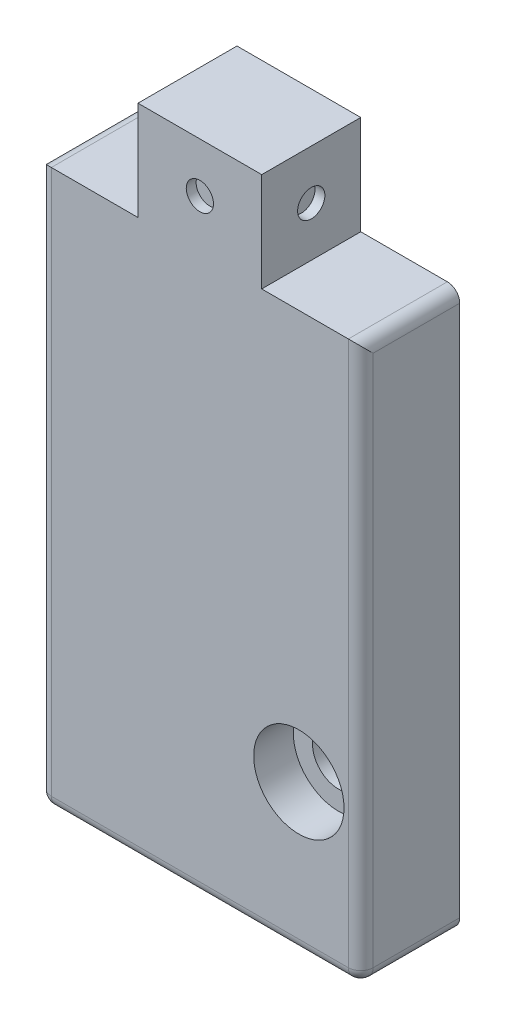
ISO-10303-21;
HEADER;
FILE_DESCRIPTION(('STEP AP214'),'2;1');
FILE_NAME('part.step','',(''),(''),'','','');
FILE_SCHEMA(('AUTOMOTIVE_DESIGN { 1 0 10303 214 1 1 1 1 }'));
ENDSEC;
DATA;
#1=APPLICATION_CONTEXT('core data for automotive mechanical design processes');
#2=APPLICATION_PROTOCOL_DEFINITION('international standard','automotive_design',2000,#1);
#3=PRODUCT_CONTEXT('',#1,'mechanical');
#4=PRODUCT('Part','Part','',(#3));
#5=PRODUCT_RELATED_PRODUCT_CATEGORY('part','',(#4));
#6=PRODUCT_DEFINITION_FORMATION('','',#4);
#7=PRODUCT_DEFINITION_CONTEXT('part definition',#1,'design');
#8=PRODUCT_DEFINITION('design','',#6,#7);
#9=PRODUCT_DEFINITION_SHAPE('','',#8);
#10=(LENGTH_UNIT() NAMED_UNIT(*) SI_UNIT(.MILLI.,.METRE.));
#11=(NAMED_UNIT(*) PLANE_ANGLE_UNIT() SI_UNIT($,.RADIAN.));
#12=(NAMED_UNIT(*) SI_UNIT($,.STERADIAN.) SOLID_ANGLE_UNIT());
#13=UNCERTAINTY_MEASURE_WITH_UNIT(LENGTH_MEASURE(1.E-05),#10,'distance_accuracy_value','');
#14=(GEOMETRIC_REPRESENTATION_CONTEXT(3) GLOBAL_UNCERTAINTY_ASSIGNED_CONTEXT((#13)) GLOBAL_UNIT_ASSIGNED_CONTEXT((#10,
#11,#12)) REPRESENTATION_CONTEXT('',''));
#15=CARTESIAN_POINT('',(0.,0.,0.));
#16=DIRECTION('',(0.,0.,1.));
#17=DIRECTION('',(1.,0.,0.));
#18=AXIS2_PLACEMENT_3D('',#15,#16,#17);
#19=CARTESIAN_POINT('',(26.67,15.24,10.16));
#20=DIRECTION('',(0.,0.,-1.));
#21=DIRECTION('',(-1.,0.,0.));
#22=AXIS2_PLACEMENT_3D('',#19,#20,#21);
#23=CYLINDRICAL_SURFACE('',#22,2.667);
#24=CARTESIAN_POINT('',(26.67,15.24,0.));
#25=DIRECTION('',(0.,0.,1.));
#26=DIRECTION('',(1.,0.,0.));
#27=AXIS2_PLACEMENT_3D('',#24,#25,#26);
#28=CIRCLE('',#27,2.667);
#29=CARTESIAN_POINT('',(29.337,15.24,0.));
#30=VERTEX_POINT('',#29);
#31=EDGE_CURVE('E166',#30,#30,#28,.T.);
#32=ORIENTED_EDGE('',*,*,#31,.F.);
#33=EDGE_LOOP('',(#32));
#34=FACE_BOUND('',#33,.T.);
#35=CARTESIAN_POINT('',(26.67,15.24,6.096));
#36=DIRECTION('',(0.,0.,1.));
#37=DIRECTION('',(1.,0.,0.));
#38=AXIS2_PLACEMENT_3D('',#35,#36,#37);
#39=CIRCLE('',#38,2.667);
#40=CARTESIAN_POINT('',(29.337,15.24,6.096));
#41=VERTEX_POINT('',#40);
#42=EDGE_CURVE('E187',#41,#41,#39,.T.);
#43=ORIENTED_EDGE('',*,*,#42,.T.);
#44=EDGE_LOOP('',(#43));
#45=FACE_BOUND('',#44,.T.);
#46=ADVANCED_FACE('F33',(#34,#45),#23,.F.);
#47=CARTESIAN_POINT('',(0.,0.,10.16));
#48=DIRECTION('',(0.,0.,1.));
#49=DIRECTION('',(1.,0.,0.));
#50=AXIS2_PLACEMENT_3D('',#47,#48,#49);
#51=PLANE('',#50);
#52=DIRECTION('',(-1.,0.,0.));
#53=VECTOR('',#52,1.);
#54=CARTESIAN_POINT('',(0.,57.15,10.16));
#55=LINE('',#54,#53);
#56=CARTESIAN_POINT('',(10.16,57.15,10.16));
#57=VERTEX_POINT('',#56);
#58=CARTESIAN_POINT('',(1.27,57.15,10.16));
#59=VERTEX_POINT('',#58);
#60=EDGE_CURVE('E159',#57,#59,#55,.T.);
#61=ORIENTED_EDGE('',*,*,#60,.T.);
#62=DIRECTION('',(0.,-1.,0.));
#63=VECTOR('',#62,1.);
#64=CARTESIAN_POINT('',(1.27,0.,10.16));
#65=LINE('',#64,#63);
#66=CARTESIAN_POINT('',(1.27,1.27,10.16));
#67=VERTEX_POINT('',#66);
#68=EDGE_CURVE('E11',#59,#67,#65,.T.);
#69=ORIENTED_EDGE('',*,*,#68,.T.);
#70=DIRECTION('',(1.,0.,0.));
#71=VECTOR('',#70,1.);
#72=CARTESIAN_POINT('',(33.02,1.27,10.16));
#73=LINE('',#72,#71);
#74=CARTESIAN_POINT('',(31.75,1.27,10.16));
#75=VERTEX_POINT('',#74);
#76=EDGE_CURVE('E49',#67,#75,#73,.T.);
#77=ORIENTED_EDGE('',*,*,#76,.T.);
#78=DIRECTION('',(0.,1.,0.));
#79=VECTOR('',#78,1.);
#80=CARTESIAN_POINT('',(31.75,57.15,10.16));
#81=LINE('',#80,#79);
#82=CARTESIAN_POINT('',(31.75,57.15,10.16));
#83=VERTEX_POINT('',#82);
#84=EDGE_CURVE('E42',#75,#83,#81,.T.);
#85=ORIENTED_EDGE('',*,*,#84,.T.);
#86=DIRECTION('',(-1.,0.,0.));
#87=VECTOR('',#86,1.);
#88=CARTESIAN_POINT('',(22.86,57.15,10.16));
#89=LINE('',#88,#87);
#90=CARTESIAN_POINT('',(22.86,57.15,10.16));
#91=VERTEX_POINT('',#90);
#92=EDGE_CURVE('E126',#83,#91,#89,.T.);
#93=ORIENTED_EDGE('',*,*,#92,.T.);
#94=DIRECTION('',(0.,1.,0.));
#95=VECTOR('',#94,1.);
#96=CARTESIAN_POINT('',(22.86,67.31,10.16));
#97=LINE('',#96,#95);
#98=CARTESIAN_POINT('',(22.86,67.31,10.16));
#99=VERTEX_POINT('',#98);
#100=EDGE_CURVE('E131',#91,#99,#97,.T.);
#101=ORIENTED_EDGE('',*,*,#100,.T.);
#102=DIRECTION('',(-1.,0.,0.));
#103=VECTOR('',#102,1.);
#104=CARTESIAN_POINT('',(10.16,67.31,10.16));
#105=LINE('',#104,#103);
#106=CARTESIAN_POINT('',(10.16,67.31,10.16));
#107=VERTEX_POINT('',#106);
#108=EDGE_CURVE('E152',#99,#107,#105,.T.);
#109=ORIENTED_EDGE('',*,*,#108,.T.);
#110=DIRECTION('',(0.,-1.,0.));
#111=VECTOR('',#110,1.);
#112=CARTESIAN_POINT('',(10.16,57.15,10.16));
#113=LINE('',#112,#111);
#114=EDGE_CURVE('E154',#107,#57,#113,.T.);
#115=ORIENTED_EDGE('',*,*,#114,.T.);
#116=EDGE_LOOP('',(#61,#69,#77,#85,#93,#101,#109,#115));
#117=FACE_BOUND('',#116,.T.);
#118=CARTESIAN_POINT('',(16.51,62.23,10.16));
#119=DIRECTION('',(0.,0.,-1.));
#120=DIRECTION('',(-1.,0.,0.));
#121=AXIS2_PLACEMENT_3D('',#118,#119,#120);
#122=CIRCLE('',#121,1.397);
#123=CARTESIAN_POINT('',(15.113,62.23,10.16));
#124=VERTEX_POINT('',#123);
#125=EDGE_CURVE('E261',#124,#124,#122,.T.);
#126=ORIENTED_EDGE('',*,*,#125,.T.);
#127=EDGE_LOOP('',(#126));
#128=FACE_BOUND('',#127,.T.);
#129=CARTESIAN_POINT('',(26.67,15.24,10.16));
#130=DIRECTION('',(0.,0.,1.));
#131=DIRECTION('',(1.,0.,0.));
#132=AXIS2_PLACEMENT_3D('',#129,#130,#131);
#133=CIRCLE('',#132,4.6355);
#134=CARTESIAN_POINT('',(31.3055,15.24,10.16));
#135=VERTEX_POINT('',#134);
#136=EDGE_CURVE('E267',#135,#135,#133,.T.);
#137=ORIENTED_EDGE('',*,*,#136,.F.);
#138=EDGE_LOOP('',(#137));
#139=FACE_BOUND('',#138,.T.);
#140=ADVANCED_FACE('F128',(#117,#128,#139),#51,.T.);
#141=CARTESIAN_POINT('',(0.,0.,0.));
#142=DIRECTION('',(0.,0.,1.));
#143=DIRECTION('',(1.,0.,0.));
#144=AXIS2_PLACEMENT_3D('',#141,#142,#143);
#145=PLANE('',#144);
#146=DIRECTION('',(-1.,0.,0.));
#147=VECTOR('',#146,1.);
#148=CARTESIAN_POINT('',(22.86,57.15,0.));
#149=LINE('',#148,#147);
#150=CARTESIAN_POINT('',(31.75,57.15,0.));
#151=VERTEX_POINT('',#150);
#152=CARTESIAN_POINT('',(22.86,57.15,0.));
#153=VERTEX_POINT('',#152);
#154=EDGE_CURVE('E143',#151,#153,#149,.T.);
#155=ORIENTED_EDGE('',*,*,#154,.F.);
#156=CARTESIAN_POINT('',(31.75,55.88,0.));
#157=DIRECTION('',(0.,0.,1.));
#158=DIRECTION('',(1.,0.,0.));
#159=AXIS2_PLACEMENT_3D('',#156,#157,#158);
#160=CIRCLE('',#159,1.27);
#161=CARTESIAN_POINT('',(33.02,55.88,0.));
#162=VERTEX_POINT('',#161);
#163=EDGE_CURVE('E198',#151,#162,#160,.F.);
#164=ORIENTED_EDGE('',*,*,#163,.T.);
#165=DIRECTION('',(0.,1.,0.));
#166=VECTOR('',#165,1.);
#167=CARTESIAN_POINT('',(33.02,57.15,0.));
#168=LINE('',#167,#166);
#169=CARTESIAN_POINT('',(33.02,1.27,0.));
#170=VERTEX_POINT('',#169);
#171=EDGE_CURVE('E169',#170,#162,#168,.T.);
#172=ORIENTED_EDGE('',*,*,#171,.F.);
#173=CARTESIAN_POINT('',(31.75,1.27,0.));
#174=DIRECTION('',(0.,0.,1.));
#175=DIRECTION('',(1.,0.,0.));
#176=AXIS2_PLACEMENT_3D('',#173,#174,#175);
#177=CIRCLE('',#176,1.27);
#178=CARTESIAN_POINT('',(31.75,0.,0.));
#179=VERTEX_POINT('',#178);
#180=EDGE_CURVE('E192',#170,#179,#177,.F.);
#181=ORIENTED_EDGE('',*,*,#180,.T.);
#182=DIRECTION('',(1.,0.,0.));
#183=VECTOR('',#182,1.);
#184=CARTESIAN_POINT('',(0.,0.,0.));
#185=LINE('',#184,#183);
#186=CARTESIAN_POINT('',(1.27,0.,0.));
#187=VERTEX_POINT('',#186);
#188=EDGE_CURVE('E165',#187,#179,#185,.T.);
#189=ORIENTED_EDGE('',*,*,#188,.F.);
#190=CARTESIAN_POINT('',(1.27,1.27,0.));
#191=DIRECTION('',(0.,0.,1.));
#192=DIRECTION('',(1.,0.,0.));
#193=AXIS2_PLACEMENT_3D('',#190,#191,#192);
#194=CIRCLE('',#193,1.27);
#195=CARTESIAN_POINT('',(0.,1.27,0.));
#196=VERTEX_POINT('',#195);
#197=EDGE_CURVE('E194',#187,#196,#194,.F.);
#198=ORIENTED_EDGE('',*,*,#197,.T.);
#199=DIRECTION('',(0.,-1.,0.));
#200=VECTOR('',#199,1.);
#201=CARTESIAN_POINT('',(0.,57.15,0.));
#202=LINE('',#201,#200);
#203=CARTESIAN_POINT('',(0.,55.88,0.));
#204=VERTEX_POINT('',#203);
#205=EDGE_CURVE('E162',#204,#196,#202,.T.);
#206=ORIENTED_EDGE('',*,*,#205,.F.);
#207=CARTESIAN_POINT('',(1.27,55.88,0.));
#208=DIRECTION('',(0.,0.,1.));
#209=DIRECTION('',(1.,0.,0.));
#210=AXIS2_PLACEMENT_3D('',#207,#208,#209);
#211=CIRCLE('',#210,1.27);
#212=CARTESIAN_POINT('',(1.27,57.15,0.));
#213=VERTEX_POINT('',#212);
#214=EDGE_CURVE('E196',#204,#213,#211,.F.);
#215=ORIENTED_EDGE('',*,*,#214,.T.);
#216=DIRECTION('',(-1.,0.,0.));
#217=VECTOR('',#216,1.);
#218=CARTESIAN_POINT('',(0.,57.15,0.));
#219=LINE('',#218,#217);
#220=CARTESIAN_POINT('',(10.16,57.15,0.));
#221=VERTEX_POINT('',#220);
#222=EDGE_CURVE('E137',#221,#213,#219,.T.);
#223=ORIENTED_EDGE('',*,*,#222,.F.);
#224=DIRECTION('',(0.,-1.,0.));
#225=VECTOR('',#224,1.);
#226=CARTESIAN_POINT('',(10.16,57.15,0.));
#227=LINE('',#226,#225);
#228=CARTESIAN_POINT('',(10.16,67.31,0.));
#229=VERTEX_POINT('',#228);
#230=EDGE_CURVE('E177',#229,#221,#227,.T.);
#231=ORIENTED_EDGE('',*,*,#230,.F.);
#232=DIRECTION('',(-1.,0.,0.));
#233=VECTOR('',#232,1.);
#234=CARTESIAN_POINT('',(10.16,67.31,0.));
#235=LINE('',#234,#233);
#236=CARTESIAN_POINT('',(22.86,67.31,0.));
#237=VERTEX_POINT('',#236);
#238=EDGE_CURVE('E175',#237,#229,#235,.T.);
#239=ORIENTED_EDGE('',*,*,#238,.F.);
#240=DIRECTION('',(0.,1.,0.));
#241=VECTOR('',#240,1.);
#242=CARTESIAN_POINT('',(22.86,67.31,0.));
#243=LINE('',#242,#241);
#244=EDGE_CURVE('E173',#153,#237,#243,.T.);
#245=ORIENTED_EDGE('',*,*,#244,.F.);
#246=EDGE_LOOP('',(#155,#164,#172,#181,#189,#198,#206,#215,#223,#231,#239,#245));
#247=FACE_BOUND('',#246,.T.);
#248=ORIENTED_EDGE('',*,*,#31,.T.);
#249=EDGE_LOOP('',(#248));
#250=FACE_BOUND('',#249,.T.);
#251=ADVANCED_FACE('F276',(#247,#250),#145,.F.);
#252=CARTESIAN_POINT('',(0.,57.15,10.16));
#253=DIRECTION('',(1.,0.,0.));
#254=DIRECTION('',(0.,0.,-1.));
#255=AXIS2_PLACEMENT_3D('',#252,#253,#254);
#256=PLANE('',#255);
#257=DIRECTION('',(0.,-1.,0.));
#258=VECTOR('',#257,1.);
#259=CARTESIAN_POINT('',(0.,57.15,8.89));
#260=LINE('',#259,#258);
#261=CARTESIAN_POINT('',(0.,1.27,8.89));
#262=VERTEX_POINT('',#261);
#263=CARTESIAN_POINT('',(0.,55.88,8.89));
#264=VERTEX_POINT('',#263);
#265=EDGE_CURVE('E206',#262,#264,#260,.F.);
#266=ORIENTED_EDGE('',*,*,#265,.T.);
#267=DIRECTION('',(0.,0.,-1.));
#268=VECTOR('',#267,1.);
#269=CARTESIAN_POINT('',(0.,55.88,10.16));
#270=LINE('',#269,#268);
#271=EDGE_CURVE('E210',#264,#204,#270,.T.);
#272=ORIENTED_EDGE('',*,*,#271,.T.);
#273=ORIENTED_EDGE('',*,*,#205,.T.);
#274=DIRECTION('',(0.,0.,-1.));
#275=VECTOR('',#274,1.);
#276=CARTESIAN_POINT('',(0.,1.27,10.16));
#277=LINE('',#276,#275);
#278=EDGE_CURVE('E208',#196,#262,#277,.F.);
#279=ORIENTED_EDGE('',*,*,#278,.T.);
#280=EDGE_LOOP('',(#266,#272,#273,#279));
#281=FACE_BOUND('',#280,.T.);
#282=ADVANCED_FACE('F302',(#281),#256,.F.);
#283=CARTESIAN_POINT('',(0.,0.,10.16));
#284=DIRECTION('',(0.,1.,0.));
#285=DIRECTION('',(0.,0.,1.));
#286=AXIS2_PLACEMENT_3D('',#283,#284,#285);
#287=PLANE('',#286);
#288=DIRECTION('',(1.,0.,0.));
#289=VECTOR('',#288,1.);
#290=CARTESIAN_POINT('',(0.,0.,8.89));
#291=LINE('',#290,#289);
#292=CARTESIAN_POINT('',(31.75,0.,8.89));
#293=VERTEX_POINT('',#292);
#294=CARTESIAN_POINT('',(1.27,0.,8.89));
#295=VERTEX_POINT('',#294);
#296=EDGE_CURVE('E214',#293,#295,#291,.F.);
#297=ORIENTED_EDGE('',*,*,#296,.T.);
#298=DIRECTION('',(0.,0.,-1.));
#299=VECTOR('',#298,1.);
#300=CARTESIAN_POINT('',(1.27,0.,10.16));
#301=LINE('',#300,#299);
#302=EDGE_CURVE('E218',#295,#187,#301,.T.);
#303=ORIENTED_EDGE('',*,*,#302,.T.);
#304=ORIENTED_EDGE('',*,*,#188,.T.);
#305=DIRECTION('',(0.,0.,-1.));
#306=VECTOR('',#305,1.);
#307=CARTESIAN_POINT('',(31.75,0.,10.16));
#308=LINE('',#307,#306);
#309=EDGE_CURVE('E216',#179,#293,#308,.F.);
#310=ORIENTED_EDGE('',*,*,#309,.T.);
#311=EDGE_LOOP('',(#297,#303,#304,#310));
#312=FACE_BOUND('',#311,.T.);
#313=ADVANCED_FACE('F325',(#312),#287,.F.);
#314=CARTESIAN_POINT('',(33.02,57.15,10.16));
#315=DIRECTION('',(-1.,0.,0.));
#316=DIRECTION('',(0.,-1.,0.));
#317=AXIS2_PLACEMENT_3D('',#314,#315,#316);
#318=PLANE('',#317);
#319=ORIENTED_EDGE('',*,*,#171,.T.);
#320=DIRECTION('',(0.,0.,-1.));
#321=VECTOR('',#320,1.);
#322=CARTESIAN_POINT('',(33.02,55.88,10.16));
#323=LINE('',#322,#321);
#324=CARTESIAN_POINT('',(33.02,55.88,8.89));
#325=VERTEX_POINT('',#324);
#326=EDGE_CURVE('E204',#162,#325,#323,.F.);
#327=ORIENTED_EDGE('',*,*,#326,.T.);
#328=DIRECTION('',(0.,1.,0.));
#329=VECTOR('',#328,1.);
#330=CARTESIAN_POINT('',(33.02,0.,8.89));
#331=LINE('',#330,#329);
#332=CARTESIAN_POINT('',(33.02,1.27,8.89));
#333=VERTEX_POINT('',#332);
#334=EDGE_CURVE('E200',#325,#333,#331,.F.);
#335=ORIENTED_EDGE('',*,*,#334,.T.);
#336=DIRECTION('',(0.,0.,-1.));
#337=VECTOR('',#336,1.);
#338=CARTESIAN_POINT('',(33.02,1.27,10.16));
#339=LINE('',#338,#337);
#340=EDGE_CURVE('E202',#333,#170,#339,.T.);
#341=ORIENTED_EDGE('',*,*,#340,.T.);
#342=EDGE_LOOP('',(#319,#327,#335,#341));
#343=FACE_BOUND('',#342,.T.);
#344=ADVANCED_FACE('F322',(#343),#318,.F.);
#345=CARTESIAN_POINT('',(22.86,57.15,10.16));
#346=DIRECTION('',(0.,-1.,0.));
#347=DIRECTION('',(1.,0.,0.));
#348=AXIS2_PLACEMENT_3D('',#345,#346,#347);
#349=PLANE('',#348);
#350=ORIENTED_EDGE('',*,*,#92,.F.);
#351=DIRECTION('',(0.,0.,-1.));
#352=VECTOR('',#351,1.);
#353=CARTESIAN_POINT('',(31.75,57.15,10.16));
#354=LINE('',#353,#352);
#355=EDGE_CURVE('E146',#83,#151,#354,.T.);
#356=ORIENTED_EDGE('',*,*,#355,.T.);
#357=ORIENTED_EDGE('',*,*,#154,.T.);
#358=DIRECTION('',(0.,0.,-1.));
#359=VECTOR('',#358,1.);
#360=CARTESIAN_POINT('',(22.86,57.15,10.16));
#361=LINE('',#360,#359);
#362=EDGE_CURVE('E140',#91,#153,#361,.T.);
#363=ORIENTED_EDGE('',*,*,#362,.F.);
#364=EDGE_LOOP('',(#350,#356,#357,#363));
#365=FACE_BOUND('',#364,.T.);
#366=ADVANCED_FACE('F141',(#365),#349,.F.);
#367=CARTESIAN_POINT('',(22.86,67.31,10.16));
#368=DIRECTION('',(-1.,0.,0.));
#369=DIRECTION('',(0.,0.,1.));
#370=AXIS2_PLACEMENT_3D('',#367,#368,#369);
#371=PLANE('',#370);
#372=CARTESIAN_POINT('',(22.86,62.23,5.08));
#373=DIRECTION('',(1.,0.,0.));
#374=DIRECTION('',(0.,0.,-1.));
#375=AXIS2_PLACEMENT_3D('',#372,#373,#374);
#376=CIRCLE('',#375,1.397);
#377=CARTESIAN_POINT('',(22.86,62.23,3.683));
#378=VERTEX_POINT('',#377);
#379=EDGE_CURVE('E255',#378,#378,#376,.T.);
#380=ORIENTED_EDGE('',*,*,#379,.F.);
#381=EDGE_LOOP('',(#380));
#382=FACE_BOUND('',#381,.T.);
#383=ORIENTED_EDGE('',*,*,#244,.T.);
#384=DIRECTION('',(0.,0.,-1.));
#385=VECTOR('',#384,1.);
#386=CARTESIAN_POINT('',(22.86,67.31,10.16));
#387=LINE('',#386,#385);
#388=EDGE_CURVE('E147',#99,#237,#387,.T.);
#389=ORIENTED_EDGE('',*,*,#388,.F.);
#390=ORIENTED_EDGE('',*,*,#100,.F.);
#391=ORIENTED_EDGE('',*,*,#362,.T.);
#392=EDGE_LOOP('',(#383,#389,#390,#391));
#393=FACE_BOUND('',#392,.T.);
#394=ADVANCED_FACE('F149',(#382,#393),#371,.F.);
#395=CARTESIAN_POINT('',(10.16,67.31,10.16));
#396=DIRECTION('',(0.,-1.,0.));
#397=DIRECTION('',(0.,0.,-1.));
#398=AXIS2_PLACEMENT_3D('',#395,#396,#397);
#399=PLANE('',#398);
#400=ORIENTED_EDGE('',*,*,#238,.T.);
#401=DIRECTION('',(0.,0.,-1.));
#402=VECTOR('',#401,1.);
#403=CARTESIAN_POINT('',(10.16,67.31,10.16));
#404=LINE('',#403,#402);
#405=EDGE_CURVE('E183',#107,#229,#404,.T.);
#406=ORIENTED_EDGE('',*,*,#405,.F.);
#407=ORIENTED_EDGE('',*,*,#108,.F.);
#408=ORIENTED_EDGE('',*,*,#388,.T.);
#409=EDGE_LOOP('',(#400,#406,#407,#408));
#410=FACE_BOUND('',#409,.T.);
#411=ADVANCED_FACE('F312',(#410),#399,.F.);
#412=CARTESIAN_POINT('',(10.16,57.15,10.16));
#413=DIRECTION('',(1.,0.,0.));
#414=DIRECTION('',(0.,0.,-1.));
#415=AXIS2_PLACEMENT_3D('',#412,#413,#414);
#416=PLANE('',#415);
#417=CARTESIAN_POINT('',(10.16,62.23,5.08));
#418=DIRECTION('',(-1.,0.,0.));
#419=DIRECTION('',(0.,0.,1.));
#420=AXIS2_PLACEMENT_3D('',#417,#418,#419);
#421=CIRCLE('',#420,1.397);
#422=CARTESIAN_POINT('',(10.16,62.23,6.477));
#423=VERTEX_POINT('',#422);
#424=EDGE_CURVE('E245',#423,#423,#421,.T.);
#425=ORIENTED_EDGE('',*,*,#424,.F.);
#426=EDGE_LOOP('',(#425));
#427=FACE_BOUND('',#426,.T.);
#428=ORIENTED_EDGE('',*,*,#230,.T.);
#429=DIRECTION('',(0.,0.,-1.));
#430=VECTOR('',#429,1.);
#431=CARTESIAN_POINT('',(10.16,57.15,10.16));
#432=LINE('',#431,#430);
#433=EDGE_CURVE('E161',#57,#221,#432,.T.);
#434=ORIENTED_EDGE('',*,*,#433,.F.);
#435=ORIENTED_EDGE('',*,*,#114,.F.);
#436=ORIENTED_EDGE('',*,*,#405,.T.);
#437=EDGE_LOOP('',(#428,#434,#435,#436));
#438=FACE_BOUND('',#437,.T.);
#439=ADVANCED_FACE('F308',(#427,#438),#416,.F.);
#440=CARTESIAN_POINT('',(0.,57.15,10.16));
#441=DIRECTION('',(0.,-1.,0.));
#442=DIRECTION('',(0.,0.,-1.));
#443=AXIS2_PLACEMENT_3D('',#440,#441,#442);
#444=PLANE('',#443);
#445=ORIENTED_EDGE('',*,*,#222,.T.);
#446=DIRECTION('',(0.,0.,-1.));
#447=VECTOR('',#446,1.);
#448=CARTESIAN_POINT('',(1.27,57.15,10.16));
#449=LINE('',#448,#447);
#450=EDGE_CURVE('E212',#213,#59,#449,.F.);
#451=ORIENTED_EDGE('',*,*,#450,.T.);
#452=ORIENTED_EDGE('',*,*,#60,.F.);
#453=ORIENTED_EDGE('',*,*,#433,.T.);
#454=EDGE_LOOP('',(#445,#451,#452,#453));
#455=FACE_BOUND('',#454,.T.);
#456=ADVANCED_FACE('F293',(#455),#444,.F.);
#457=CARTESIAN_POINT('',(26.67,15.24,6.096));
#458=DIRECTION('',(0.,0.,1.));
#459=DIRECTION('',(1.,0.,0.));
#460=AXIS2_PLACEMENT_3D('',#457,#458,#459);
#461=CYLINDRICAL_SURFACE('',#460,4.6355);
#462=CARTESIAN_POINT('',(26.67,15.24,6.096));
#463=DIRECTION('',(0.,0.,1.));
#464=DIRECTION('',(1.,0.,0.));
#465=AXIS2_PLACEMENT_3D('',#462,#463,#464);
#466=CIRCLE('',#465,4.6355);
#467=CARTESIAN_POINT('',(31.3055,15.24,6.096));
#468=VERTEX_POINT('',#467);
#469=EDGE_CURVE('E190',#468,#468,#466,.T.);
#470=ORIENTED_EDGE('',*,*,#469,.F.);
#471=EDGE_LOOP('',(#470));
#472=FACE_BOUND('',#471,.T.);
#473=ORIENTED_EDGE('',*,*,#136,.T.);
#474=EDGE_LOOP('',(#473));
#475=FACE_BOUND('',#474,.T.);
#476=ADVANCED_FACE('F287',(#472,#475),#461,.F.);
#477=CARTESIAN_POINT('',(26.67,15.24,6.096));
#478=DIRECTION('',(0.,0.,1.));
#479=DIRECTION('',(1.,0.,0.));
#480=AXIS2_PLACEMENT_3D('',#477,#478,#479);
#481=PLANE('',#480);
#482=ORIENTED_EDGE('',*,*,#42,.F.);
#483=EDGE_LOOP('',(#482));
#484=FACE_BOUND('',#483,.T.);
#485=ORIENTED_EDGE('',*,*,#469,.T.);
#486=EDGE_LOOP('',(#485));
#487=FACE_BOUND('',#486,.T.);
#488=ADVANCED_FACE('F283',(#484,#487),#481,.T.);
#489=CARTESIAN_POINT('',(16.51,62.23,9.144));
#490=DIRECTION('',(0.,0.,1.));
#491=DIRECTION('',(1.,0.,0.));
#492=AXIS2_PLACEMENT_3D('',#489,#490,#491);
#493=CYLINDRICAL_SURFACE('',#492,1.397);
#494=CARTESIAN_POINT('',(16.51,62.23,9.144));
#495=DIRECTION('',(0.,0.,-1.));
#496=DIRECTION('',(-1.,0.,0.));
#497=AXIS2_PLACEMENT_3D('',#494,#495,#496);
#498=CIRCLE('',#497,1.397);
#499=CARTESIAN_POINT('',(15.113,62.23,9.144));
#500=VERTEX_POINT('',#499);
#501=EDGE_CURVE('E264',#500,#500,#498,.T.);
#502=ORIENTED_EDGE('',*,*,#501,.T.);
#503=EDGE_LOOP('',(#502));
#504=FACE_BOUND('',#503,.T.);
#505=ORIENTED_EDGE('',*,*,#125,.F.);
#506=EDGE_LOOP('',(#505));
#507=FACE_BOUND('',#506,.T.);
#508=ADVANCED_FACE('F286',(#504,#507),#493,.F.);
#509=CARTESIAN_POINT('',(16.51,62.23,9.144));
#510=DIRECTION('',(0.,0.,-1.));
#511=DIRECTION('',(-1.,0.,0.));
#512=AXIS2_PLACEMENT_3D('',#509,#510,#511);
#513=PLANE('',#512);
#514=ORIENTED_EDGE('',*,*,#501,.F.);
#515=EDGE_LOOP('',(#514));
#516=FACE_BOUND('',#515,.T.);
#517=ADVANCED_FACE('F411',(#516),#513,.F.);
#518=CARTESIAN_POINT('',(21.844,62.23,5.08));
#519=DIRECTION('',(1.,0.,0.));
#520=DIRECTION('',(0.,0.,-1.));
#521=AXIS2_PLACEMENT_3D('',#518,#519,#520);
#522=CYLINDRICAL_SURFACE('',#521,1.397);
#523=CARTESIAN_POINT('',(21.844,62.23,5.08));
#524=DIRECTION('',(1.,0.,0.));
#525=DIRECTION('',(0.,0.,-1.));
#526=AXIS2_PLACEMENT_3D('',#523,#524,#525);
#527=CIRCLE('',#526,1.397);
#528=CARTESIAN_POINT('',(21.844,62.23,3.683));
#529=VERTEX_POINT('',#528);
#530=EDGE_CURVE('E258',#529,#529,#527,.T.);
#531=ORIENTED_EDGE('',*,*,#530,.F.);
#532=EDGE_LOOP('',(#531));
#533=FACE_BOUND('',#532,.T.);
#534=ORIENTED_EDGE('',*,*,#379,.T.);
#535=EDGE_LOOP('',(#534));
#536=FACE_BOUND('',#535,.T.);
#537=ADVANCED_FACE('F407',(#533,#536),#522,.F.);
#538=CARTESIAN_POINT('',(21.844,62.23,5.08));
#539=DIRECTION('',(1.,0.,0.));
#540=DIRECTION('',(0.,0.,-1.));
#541=AXIS2_PLACEMENT_3D('',#538,#539,#540);
#542=PLANE('',#541);
#543=ORIENTED_EDGE('',*,*,#530,.T.);
#544=EDGE_LOOP('',(#543));
#545=FACE_BOUND('',#544,.T.);
#546=ADVANCED_FACE('F401',(#545),#542,.T.);
#547=CARTESIAN_POINT('',(11.176,62.23,5.08));
#548=DIRECTION('',(-1.,0.,0.));
#549=DIRECTION('',(0.,0.,1.));
#550=AXIS2_PLACEMENT_3D('',#547,#548,#549);
#551=CYLINDRICAL_SURFACE('',#550,1.397);
#552=CARTESIAN_POINT('',(11.176,62.23,5.08));
#553=DIRECTION('',(-1.,0.,0.));
#554=DIRECTION('',(0.,0.,1.));
#555=AXIS2_PLACEMENT_3D('',#552,#553,#554);
#556=CIRCLE('',#555,1.397);
#557=CARTESIAN_POINT('',(11.176,62.23,6.477));
#558=VERTEX_POINT('',#557);
#559=EDGE_CURVE('E250',#558,#558,#556,.T.);
#560=ORIENTED_EDGE('',*,*,#559,.F.);
#561=EDGE_LOOP('',(#560));
#562=FACE_BOUND('',#561,.T.);
#563=ORIENTED_EDGE('',*,*,#424,.T.);
#564=EDGE_LOOP('',(#563));
#565=FACE_BOUND('',#564,.T.);
#566=ADVANCED_FACE('F395',(#562,#565),#551,.F.);
#567=CARTESIAN_POINT('',(11.176,62.23,5.08));
#568=DIRECTION('',(-1.,0.,0.));
#569=DIRECTION('',(0.,0.,1.));
#570=AXIS2_PLACEMENT_3D('',#567,#568,#569);
#571=PLANE('',#570);
#572=ORIENTED_EDGE('',*,*,#559,.T.);
#573=EDGE_LOOP('',(#572));
#574=FACE_BOUND('',#573,.T.);
#575=ADVANCED_FACE('F364',(#574),#571,.T.);
#576=CARTESIAN_POINT('',(1.27,55.88,10.16));
#577=DIRECTION('',(0.,0.,-1.));
#578=DIRECTION('',(-1.,0.,0.));
#579=AXIS2_PLACEMENT_3D('',#576,#577,#578);
#580=CYLINDRICAL_SURFACE('',#579,1.27);
#581=ORIENTED_EDGE('',*,*,#214,.F.);
#582=ORIENTED_EDGE('',*,*,#271,.F.);
#583=CARTESIAN_POINT('',(1.27,55.88,8.89));
#584=DIRECTION('',(0.,0.707106781186547,-0.707106781186547));
#585=DIRECTION('',(0.,0.707106781186547,0.707106781186547));
#586=AXIS2_PLACEMENT_3D('',#583,#584,#585);
#587=ELLIPSE('',#586,1.79605122421383,1.27);
#588=EDGE_CURVE('E37',#59,#264,#587,.F.);
#589=ORIENTED_EDGE('',*,*,#588,.F.);
#590=ORIENTED_EDGE('',*,*,#450,.F.);
#591=EDGE_LOOP('',(#581,#582,#589,#590));
#592=FACE_BOUND('',#591,.T.);
#593=ADVANCED_FACE('F35',(#592),#580,.T.);
#594=CARTESIAN_POINT('',(1.27,1.27,10.16));
#595=DIRECTION('',(0.,0.,-1.));
#596=DIRECTION('',(-1.,0.,0.));
#597=AXIS2_PLACEMENT_3D('',#594,#595,#596);
#598=CYLINDRICAL_SURFACE('',#597,1.27);
#599=ORIENTED_EDGE('',*,*,#197,.F.);
#600=ORIENTED_EDGE('',*,*,#302,.F.);
#601=CARTESIAN_POINT('',(1.27,1.27,8.89));
#602=DIRECTION('',(0.,0.,1.));
#603=DIRECTION('',(1.,0.,0.));
#604=AXIS2_PLACEMENT_3D('',#601,#602,#603);
#605=CIRCLE('',#604,1.27);
#606=EDGE_CURVE('E239',#262,#295,#605,.T.);
#607=ORIENTED_EDGE('',*,*,#606,.F.);
#608=ORIENTED_EDGE('',*,*,#278,.F.);
#609=EDGE_LOOP('',(#599,#600,#607,#608));
#610=FACE_BOUND('',#609,.T.);
#611=ADVANCED_FACE('F358',(#610),#598,.T.);
#612=CARTESIAN_POINT('',(1.27,0.,8.89));
#613=DIRECTION('',(0.,1.,0.));
#614=DIRECTION('',(0.,0.,1.));
#615=AXIS2_PLACEMENT_3D('',#612,#613,#614);
#616=CYLINDRICAL_SURFACE('',#615,1.27);
#617=ORIENTED_EDGE('',*,*,#588,.T.);
#618=ORIENTED_EDGE('',*,*,#265,.F.);
#619=CARTESIAN_POINT('',(1.27,1.27,8.89));
#620=DIRECTION('',(0.,-1.,0.));
#621=DIRECTION('',(0.,0.,-1.));
#622=AXIS2_PLACEMENT_3D('',#619,#620,#621);
#623=CIRCLE('',#622,1.27);
#624=EDGE_CURVE('E237',#67,#262,#623,.T.);
#625=ORIENTED_EDGE('',*,*,#624,.F.);
#626=ORIENTED_EDGE('',*,*,#68,.F.);
#627=EDGE_LOOP('',(#617,#618,#625,#626));
#628=FACE_BOUND('',#627,.T.);
#629=ADVANCED_FACE('F356',(#628),#616,.T.);
#630=CARTESIAN_POINT('',(1.27,1.27,8.89));
#631=DIRECTION('',(0.,0.,1.));
#632=DIRECTION('',(1.,0.,0.));
#633=AXIS2_PLACEMENT_3D('',#630,#631,#632);
#634=SPHERICAL_SURFACE('',#633,1.27);
#635=ORIENTED_EDGE('',*,*,#624,.T.);
#636=ORIENTED_EDGE('',*,*,#606,.T.);
#637=CARTESIAN_POINT('',(1.27,1.27,8.89));
#638=DIRECTION('',(-1.,0.,0.));
#639=DIRECTION('',(0.,0.,1.));
#640=AXIS2_PLACEMENT_3D('',#637,#638,#639);
#641=CIRCLE('',#640,1.27);
#642=EDGE_CURVE('E234',#67,#295,#641,.F.);
#643=ORIENTED_EDGE('',*,*,#642,.F.);
#644=EDGE_LOOP('',(#635,#636,#643));
#645=FACE_BOUND('',#644,.T.);
#646=ADVANCED_FACE('F352',(#645),#634,.T.);
#647=CARTESIAN_POINT('',(31.75,1.27,10.16));
#648=DIRECTION('',(0.,0.,-1.));
#649=DIRECTION('',(-1.,0.,0.));
#650=AXIS2_PLACEMENT_3D('',#647,#648,#649);
#651=CYLINDRICAL_SURFACE('',#650,1.27);
#652=ORIENTED_EDGE('',*,*,#180,.F.);
#653=ORIENTED_EDGE('',*,*,#340,.F.);
#654=CARTESIAN_POINT('',(31.75,1.27,8.89));
#655=DIRECTION('',(0.,0.,1.));
#656=DIRECTION('',(1.,0.,0.));
#657=AXIS2_PLACEMENT_3D('',#654,#655,#656);
#658=CIRCLE('',#657,1.27);
#659=EDGE_CURVE('E231',#293,#333,#658,.T.);
#660=ORIENTED_EDGE('',*,*,#659,.F.);
#661=ORIENTED_EDGE('',*,*,#309,.F.);
#662=EDGE_LOOP('',(#652,#653,#660,#661));
#663=FACE_BOUND('',#662,.T.);
#664=ADVANCED_FACE('F348',(#663),#651,.T.);
#665=CARTESIAN_POINT('',(0.,1.27,8.89));
#666=DIRECTION('',(-1.,0.,0.));
#667=DIRECTION('',(0.,0.,1.));
#668=AXIS2_PLACEMENT_3D('',#665,#666,#667);
#669=CYLINDRICAL_SURFACE('',#668,1.27);
#670=ORIENTED_EDGE('',*,*,#642,.T.);
#671=ORIENTED_EDGE('',*,*,#296,.F.);
#672=CARTESIAN_POINT('',(31.75,1.27,8.89));
#673=DIRECTION('',(1.,0.,0.));
#674=DIRECTION('',(0.,0.,-1.));
#675=AXIS2_PLACEMENT_3D('',#672,#673,#674);
#676=CIRCLE('',#675,1.27);
#677=EDGE_CURVE('E228',#75,#293,#676,.T.);
#678=ORIENTED_EDGE('',*,*,#677,.F.);
#679=ORIENTED_EDGE('',*,*,#76,.F.);
#680=EDGE_LOOP('',(#670,#671,#678,#679));
#681=FACE_BOUND('',#680,.T.);
#682=ADVANCED_FACE('F344',(#681),#669,.T.);
#683=CARTESIAN_POINT('',(31.75,1.27,8.89));
#684=DIRECTION('',(0.,0.,1.));
#685=DIRECTION('',(1.,0.,0.));
#686=AXIS2_PLACEMENT_3D('',#683,#684,#685);
#687=SPHERICAL_SURFACE('',#686,1.27);
#688=ORIENTED_EDGE('',*,*,#677,.T.);
#689=ORIENTED_EDGE('',*,*,#659,.T.);
#690=CARTESIAN_POINT('',(31.75,1.27,8.89));
#691=DIRECTION('',(0.,-1.,0.));
#692=DIRECTION('',(0.,0.,-1.));
#693=AXIS2_PLACEMENT_3D('',#690,#691,#692);
#694=CIRCLE('',#693,1.27);
#695=EDGE_CURVE('E225',#75,#333,#694,.F.);
#696=ORIENTED_EDGE('',*,*,#695,.F.);
#697=EDGE_LOOP('',(#688,#689,#696));
#698=FACE_BOUND('',#697,.T.);
#699=ADVANCED_FACE('F340',(#698),#687,.T.);
#700=CARTESIAN_POINT('',(31.75,0.,8.89));
#701=DIRECTION('',(0.,-1.,0.));
#702=DIRECTION('',(1.,0.,0.));
#703=AXIS2_PLACEMENT_3D('',#700,#701,#702);
#704=CYLINDRICAL_SURFACE('',#703,1.27);
#705=ORIENTED_EDGE('',*,*,#695,.T.);
#706=ORIENTED_EDGE('',*,*,#334,.F.);
#707=CARTESIAN_POINT('',(31.75,55.88,8.89));
#708=DIRECTION('',(0.,-0.707106781186547,0.707106781186547));
#709=DIRECTION('',(0.,-0.707106781186547,-0.707106781186547));
#710=AXIS2_PLACEMENT_3D('',#707,#708,#709);
#711=ELLIPSE('',#710,1.79605122421383,1.27);
#712=EDGE_CURVE('E222',#83,#325,#711,.F.);
#713=ORIENTED_EDGE('',*,*,#712,.F.);
#714=ORIENTED_EDGE('',*,*,#84,.F.);
#715=EDGE_LOOP('',(#705,#706,#713,#714));
#716=FACE_BOUND('',#715,.T.);
#717=ADVANCED_FACE('F336',(#716),#704,.T.);
#718=CARTESIAN_POINT('',(31.75,55.88,10.16));
#719=DIRECTION('',(0.,0.,-1.));
#720=DIRECTION('',(-1.,0.,0.));
#721=AXIS2_PLACEMENT_3D('',#718,#719,#720);
#722=CYLINDRICAL_SURFACE('',#721,1.27);
#723=ORIENTED_EDGE('',*,*,#712,.T.);
#724=ORIENTED_EDGE('',*,*,#326,.F.);
#725=ORIENTED_EDGE('',*,*,#163,.F.);
#726=ORIENTED_EDGE('',*,*,#355,.F.);
#727=EDGE_LOOP('',(#723,#724,#725,#726));
#728=FACE_BOUND('',#727,.T.);
#729=ADVANCED_FACE('F333',(#728),#722,.T.);
#730=CLOSED_SHELL('',(#46,#140,#251,#282,#313,#344,#366,#394,#411,#439,#456,#476,#488,#508,#517,
#537,#546,#566,#575,#593,#611,#629,#646,#664,#682,#699,#717,#729));
#731=MANIFOLD_SOLID_BREP('B2',#730);
#732=ADVANCED_BREP_SHAPE_REPRESENTATION('',(#18,#731),#14);
#733=SHAPE_DEFINITION_REPRESENTATION(#9,#732);
ENDSEC;
END-ISO-10303-21;
